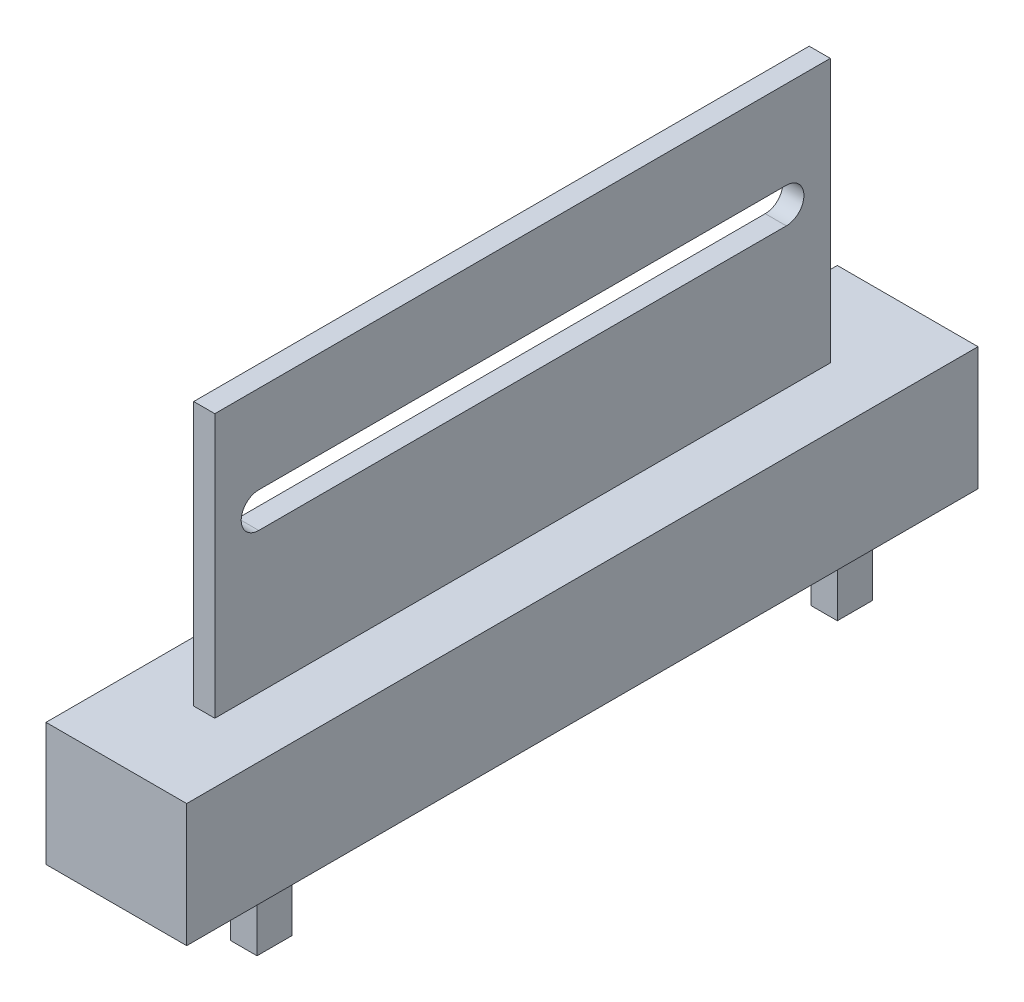
ISO-10303-21;
HEADER;
FILE_DESCRIPTION(('STEP AP214'),'2;1');
FILE_NAME('part.step','',(''),(''),'','','');
FILE_SCHEMA(('AUTOMOTIVE_DESIGN { 1 0 10303 214 1 1 1 1 }'));
ENDSEC;
DATA;
#1=APPLICATION_CONTEXT('core data for automotive mechanical design processes');
#2=APPLICATION_PROTOCOL_DEFINITION('international standard','automotive_design',2000,#1);
#3=PRODUCT_CONTEXT('',#1,'mechanical');
#4=PRODUCT('Part','Part','',(#3));
#5=PRODUCT_RELATED_PRODUCT_CATEGORY('part','',(#4));
#6=PRODUCT_DEFINITION_FORMATION('','',#4);
#7=PRODUCT_DEFINITION_CONTEXT('part definition',#1,'design');
#8=PRODUCT_DEFINITION('design','',#6,#7);
#9=PRODUCT_DEFINITION_SHAPE('','',#8);
#10=(LENGTH_UNIT() NAMED_UNIT(*) SI_UNIT(.MILLI.,.METRE.));
#11=(NAMED_UNIT(*) PLANE_ANGLE_UNIT() SI_UNIT($,.RADIAN.));
#12=(NAMED_UNIT(*) SI_UNIT($,.STERADIAN.) SOLID_ANGLE_UNIT());
#13=UNCERTAINTY_MEASURE_WITH_UNIT(LENGTH_MEASURE(1.E-05),#10,'distance_accuracy_value','');
#14=(GEOMETRIC_REPRESENTATION_CONTEXT(3) GLOBAL_UNCERTAINTY_ASSIGNED_CONTEXT((#13)) GLOBAL_UNIT_ASSIGNED_CONTEXT((#10,
#11,#12)) REPRESENTATION_CONTEXT('',''));
#15=CARTESIAN_POINT('',(0.,0.,0.));
#16=DIRECTION('',(0.,0.,1.));
#17=DIRECTION('',(1.,0.,0.));
#18=AXIS2_PLACEMENT_3D('',#15,#16,#17);
#19=CARTESIAN_POINT('',(-3.,-3.5,-38.));
#20=DIRECTION('',(0.,0.,-1.));
#21=DIRECTION('',(-1.,0.,0.));
#22=AXIS2_PLACEMENT_3D('',#19,#20,#21);
#23=PLANE('',#22);
#24=DIRECTION('',(-1.,0.,0.));
#25=VECTOR('',#24,1.);
#26=CARTESIAN_POINT('',(-3.,0.,-38.));
#27=LINE('',#26,#25);
#28=CARTESIAN_POINT('',(-1.5,0.,-38.));
#29=VERTEX_POINT('',#28);
#30=CARTESIAN_POINT('',(-3.,0.,-38.));
#31=VERTEX_POINT('',#30);
#32=EDGE_CURVE('E12',#29,#31,#27,.T.);
#33=ORIENTED_EDGE('',*,*,#32,.T.);
#34=DIRECTION('',(0.,1.,0.));
#35=VECTOR('',#34,1.);
#36=CARTESIAN_POINT('',(-3.,-3.5,-38.));
#37=LINE('',#36,#35);
#38=CARTESIAN_POINT('',(-3.,-3.5,-38.));
#39=VERTEX_POINT('',#38);
#40=EDGE_CURVE('E121',#39,#31,#37,.T.);
#41=ORIENTED_EDGE('',*,*,#40,.F.);
#42=DIRECTION('',(-1.,0.,0.));
#43=VECTOR('',#42,1.);
#44=CARTESIAN_POINT('',(-3.,-3.5,-38.));
#45=LINE('',#44,#43);
#46=CARTESIAN_POINT('',(-1.5,-3.5,-38.));
#47=VERTEX_POINT('',#46);
#48=EDGE_CURVE('E54',#47,#39,#45,.T.);
#49=ORIENTED_EDGE('',*,*,#48,.F.);
#50=DIRECTION('',(0.,1.,0.));
#51=VECTOR('',#50,1.);
#52=CARTESIAN_POINT('',(-1.5,-3.5,-38.));
#53=LINE('',#52,#51);
#54=EDGE_CURVE('E109',#47,#29,#53,.T.);
#55=ORIENTED_EDGE('',*,*,#54,.T.);
#56=EDGE_LOOP('',(#33,#41,#49,#55));
#57=FACE_BOUND('',#56,.T.);
#58=ADVANCED_FACE('F50',(#57),#23,.F.);
#59=CARTESIAN_POINT('',(-3.,-3.5,-38.));
#60=DIRECTION('',(1.,0.,0.));
#61=DIRECTION('',(0.,0.,-1.));
#62=AXIS2_PLACEMENT_3D('',#59,#60,#61);
#63=PLANE('',#62);
#64=DIRECTION('',(0.,0.,-1.));
#65=VECTOR('',#64,1.);
#66=CARTESIAN_POINT('',(-3.,0.,-38.));
#67=LINE('',#66,#65);
#68=CARTESIAN_POINT('',(-3.,0.,-40.));
#69=VERTEX_POINT('',#68);
#70=EDGE_CURVE('E60',#31,#69,#67,.T.);
#71=ORIENTED_EDGE('',*,*,#70,.T.);
#72=DIRECTION('',(0.,1.,0.));
#73=VECTOR('',#72,1.);
#74=CARTESIAN_POINT('',(-3.,-3.5,-40.));
#75=LINE('',#74,#73);
#76=CARTESIAN_POINT('',(-3.,-3.5,-40.));
#77=VERTEX_POINT('',#76);
#78=EDGE_CURVE('E105',#77,#69,#75,.T.);
#79=ORIENTED_EDGE('',*,*,#78,.F.);
#80=DIRECTION('',(0.,0.,-1.));
#81=VECTOR('',#80,1.);
#82=CARTESIAN_POINT('',(-3.,-3.5,-38.));
#83=LINE('',#82,#81);
#84=EDGE_CURVE('E84',#39,#77,#83,.T.);
#85=ORIENTED_EDGE('',*,*,#84,.F.);
#86=ORIENTED_EDGE('',*,*,#40,.T.);
#87=EDGE_LOOP('',(#71,#79,#85,#86));
#88=FACE_BOUND('',#87,.T.);
#89=ADVANCED_FACE('F124',(#88),#63,.F.);
#90=CARTESIAN_POINT('',(-3.,-3.5,-40.));
#91=DIRECTION('',(0.,0.,1.));
#92=DIRECTION('',(1.,0.,0.));
#93=AXIS2_PLACEMENT_3D('',#90,#91,#92);
#94=PLANE('',#93);
#95=DIRECTION('',(1.,0.,0.));
#96=VECTOR('',#95,1.);
#97=CARTESIAN_POINT('',(-3.,0.,-40.));
#98=LINE('',#97,#96);
#99=CARTESIAN_POINT('',(-1.5,0.,-40.));
#100=VERTEX_POINT('',#99);
#101=EDGE_CURVE('E100',#69,#100,#98,.T.);
#102=ORIENTED_EDGE('',*,*,#101,.T.);
#103=DIRECTION('',(0.,1.,0.));
#104=VECTOR('',#103,1.);
#105=CARTESIAN_POINT('',(-1.5,-3.5,-40.));
#106=LINE('',#105,#104);
#107=CARTESIAN_POINT('',(-1.5,-3.5,-40.));
#108=VERTEX_POINT('',#107);
#109=EDGE_CURVE('E103',#108,#100,#106,.T.);
#110=ORIENTED_EDGE('',*,*,#109,.F.);
#111=DIRECTION('',(1.,0.,0.));
#112=VECTOR('',#111,1.);
#113=CARTESIAN_POINT('',(-3.,-3.5,-40.));
#114=LINE('',#113,#112);
#115=EDGE_CURVE('E117',#77,#108,#114,.T.);
#116=ORIENTED_EDGE('',*,*,#115,.F.);
#117=ORIENTED_EDGE('',*,*,#78,.T.);
#118=EDGE_LOOP('',(#102,#110,#116,#117));
#119=FACE_BOUND('',#118,.T.);
#120=ADVANCED_FACE('F101',(#119),#94,.F.);
#121=CARTESIAN_POINT('',(-1.5,-3.5,-38.));
#122=DIRECTION('',(-1.,0.,0.));
#123=DIRECTION('',(0.,0.,1.));
#124=AXIS2_PLACEMENT_3D('',#121,#122,#123);
#125=PLANE('',#124);
#126=DIRECTION('',(0.,0.,1.));
#127=VECTOR('',#126,1.);
#128=CARTESIAN_POINT('',(-1.5,0.,-38.));
#129=LINE('',#128,#127);
#130=EDGE_CURVE('E94',#100,#29,#129,.T.);
#131=ORIENTED_EDGE('',*,*,#130,.T.);
#132=ORIENTED_EDGE('',*,*,#54,.F.);
#133=DIRECTION('',(0.,0.,1.));
#134=VECTOR('',#133,1.);
#135=CARTESIAN_POINT('',(-1.5,-3.5,-38.));
#136=LINE('',#135,#134);
#137=EDGE_CURVE('E108',#108,#47,#136,.T.);
#138=ORIENTED_EDGE('',*,*,#137,.F.);
#139=ORIENTED_EDGE('',*,*,#109,.T.);
#140=EDGE_LOOP('',(#131,#132,#138,#139));
#141=FACE_BOUND('',#140,.T.);
#142=ADVANCED_FACE('F107',(#141),#125,.F.);
#143=CARTESIAN_POINT('',(0.,-3.5,0.));
#144=DIRECTION('',(0.,1.,0.));
#145=DIRECTION('',(0.,0.,1.));
#146=AXIS2_PLACEMENT_3D('',#143,#144,#145);
#147=PLANE('',#146);
#148=ORIENTED_EDGE('',*,*,#48,.T.);
#149=ORIENTED_EDGE('',*,*,#84,.T.);
#150=ORIENTED_EDGE('',*,*,#115,.T.);
#151=ORIENTED_EDGE('',*,*,#137,.T.);
#152=EDGE_LOOP('',(#148,#149,#150,#151));
#153=FACE_BOUND('',#152,.T.);
#154=ADVANCED_FACE('F52',(#153),#147,.F.);
#155=CARTESIAN_POINT('',(0.,0.,0.));
#156=DIRECTION('',(0.,1.,0.));
#157=DIRECTION('',(0.,0.,1.));
#158=AXIS2_PLACEMENT_3D('',#155,#156,#157);
#159=PLANE('',#158);
#160=ORIENTED_EDGE('',*,*,#32,.F.);
#161=ORIENTED_EDGE('',*,*,#130,.F.);
#162=ORIENTED_EDGE('',*,*,#101,.F.);
#163=ORIENTED_EDGE('',*,*,#70,.F.);
#164=EDGE_LOOP('',(#160,#161,#162,#163));
#165=FACE_BOUND('',#164,.T.);
#166=ADVANCED_FACE('F111',(#165),#159,.T.);
#167=CLOSED_SHELL('',(#58,#89,#120,#142,#154,#166));
#168=MANIFOLD_SOLID_BREP('B2',#167);
#169=CARTESIAN_POINT('',(1.50000000000001,-3.5,-40.));
#170=DIRECTION('',(0.,0.,1.));
#171=DIRECTION('',(1.,0.,0.));
#172=AXIS2_PLACEMENT_3D('',#169,#170,#171);
#173=PLANE('',#172);
#174=DIRECTION('',(1.,0.,0.));
#175=VECTOR('',#174,1.);
#176=CARTESIAN_POINT('',(1.50000000000001,0.,-40.));
#177=LINE('',#176,#175);
#178=CARTESIAN_POINT('',(1.50000000000001,0.,-40.));
#179=VERTEX_POINT('',#178);
#180=CARTESIAN_POINT('',(3.00000000000001,0.,-40.));
#181=VERTEX_POINT('',#180);
#182=EDGE_CURVE('E48',#179,#181,#177,.T.);
#183=ORIENTED_EDGE('',*,*,#182,.T.);
#184=DIRECTION('',(0.,1.,0.));
#185=VECTOR('',#184,1.);
#186=CARTESIAN_POINT('',(3.00000000000001,-3.5,-40.));
#187=LINE('',#186,#185);
#188=CARTESIAN_POINT('',(3.00000000000001,-3.5,-40.));
#189=VERTEX_POINT('',#188);
#190=EDGE_CURVE('E267',#189,#181,#187,.T.);
#191=ORIENTED_EDGE('',*,*,#190,.F.);
#192=DIRECTION('',(1.,0.,0.));
#193=VECTOR('',#192,1.);
#194=CARTESIAN_POINT('',(1.50000000000001,-3.5,-40.));
#195=LINE('',#194,#193);
#196=CARTESIAN_POINT('',(1.50000000000001,-3.5,-40.));
#197=VERTEX_POINT('',#196);
#198=EDGE_CURVE('E200',#197,#189,#195,.T.);
#199=ORIENTED_EDGE('',*,*,#198,.F.);
#200=DIRECTION('',(0.,1.,0.));
#201=VECTOR('',#200,1.);
#202=CARTESIAN_POINT('',(1.50000000000001,-3.5,-40.));
#203=LINE('',#202,#201);
#204=EDGE_CURVE('E255',#197,#179,#203,.T.);
#205=ORIENTED_EDGE('',*,*,#204,.T.);
#206=EDGE_LOOP('',(#183,#191,#199,#205));
#207=FACE_BOUND('',#206,.T.);
#208=ADVANCED_FACE('F196',(#207),#173,.F.);
#209=CARTESIAN_POINT('',(3.00000000000001,-3.5,-40.));
#210=DIRECTION('',(-1.,0.,0.));
#211=DIRECTION('',(0.,0.,1.));
#212=AXIS2_PLACEMENT_3D('',#209,#210,#211);
#213=PLANE('',#212);
#214=DIRECTION('',(0.,0.,1.));
#215=VECTOR('',#214,1.);
#216=CARTESIAN_POINT('',(3.00000000000001,0.,-40.));
#217=LINE('',#216,#215);
#218=CARTESIAN_POINT('',(3.00000000000001,0.,-38.));
#219=VERTEX_POINT('',#218);
#220=EDGE_CURVE('E206',#181,#219,#217,.T.);
#221=ORIENTED_EDGE('',*,*,#220,.T.);
#222=DIRECTION('',(0.,1.,0.));
#223=VECTOR('',#222,1.);
#224=CARTESIAN_POINT('',(3.00000000000001,-3.5,-38.));
#225=LINE('',#224,#223);
#226=CARTESIAN_POINT('',(3.00000000000001,-3.5,-38.));
#227=VERTEX_POINT('',#226);
#228=EDGE_CURVE('E251',#227,#219,#225,.T.);
#229=ORIENTED_EDGE('',*,*,#228,.F.);
#230=DIRECTION('',(0.,0.,1.));
#231=VECTOR('',#230,1.);
#232=CARTESIAN_POINT('',(3.00000000000001,-3.5,-40.));
#233=LINE('',#232,#231);
#234=EDGE_CURVE('E230',#189,#227,#233,.T.);
#235=ORIENTED_EDGE('',*,*,#234,.F.);
#236=ORIENTED_EDGE('',*,*,#190,.T.);
#237=EDGE_LOOP('',(#221,#229,#235,#236));
#238=FACE_BOUND('',#237,.T.);
#239=ADVANCED_FACE('F270',(#238),#213,.F.);
#240=CARTESIAN_POINT('',(1.50000000000001,-3.5,-38.));
#241=DIRECTION('',(0.,0.,-1.));
#242=DIRECTION('',(-1.,0.,0.));
#243=AXIS2_PLACEMENT_3D('',#240,#241,#242);
#244=PLANE('',#243);
#245=DIRECTION('',(-1.,0.,0.));
#246=VECTOR('',#245,1.);
#247=CARTESIAN_POINT('',(1.50000000000001,0.,-38.));
#248=LINE('',#247,#246);
#249=CARTESIAN_POINT('',(1.50000000000001,0.,-38.));
#250=VERTEX_POINT('',#249);
#251=EDGE_CURVE('E246',#219,#250,#248,.T.);
#252=ORIENTED_EDGE('',*,*,#251,.T.);
#253=DIRECTION('',(0.,1.,0.));
#254=VECTOR('',#253,1.);
#255=CARTESIAN_POINT('',(1.50000000000001,-3.5,-38.));
#256=LINE('',#255,#254);
#257=CARTESIAN_POINT('',(1.50000000000001,-3.5,-38.));
#258=VERTEX_POINT('',#257);
#259=EDGE_CURVE('E249',#258,#250,#256,.T.);
#260=ORIENTED_EDGE('',*,*,#259,.F.);
#261=DIRECTION('',(-1.,0.,0.));
#262=VECTOR('',#261,1.);
#263=CARTESIAN_POINT('',(1.50000000000001,-3.5,-38.));
#264=LINE('',#263,#262);
#265=EDGE_CURVE('E263',#227,#258,#264,.T.);
#266=ORIENTED_EDGE('',*,*,#265,.F.);
#267=ORIENTED_EDGE('',*,*,#228,.T.);
#268=EDGE_LOOP('',(#252,#260,#266,#267));
#269=FACE_BOUND('',#268,.T.);
#270=ADVANCED_FACE('F247',(#269),#244,.F.);
#271=CARTESIAN_POINT('',(1.50000000000001,-3.5,-40.));
#272=DIRECTION('',(1.,0.,0.));
#273=DIRECTION('',(0.,0.,-1.));
#274=AXIS2_PLACEMENT_3D('',#271,#272,#273);
#275=PLANE('',#274);
#276=DIRECTION('',(0.,0.,-1.));
#277=VECTOR('',#276,1.);
#278=CARTESIAN_POINT('',(1.50000000000001,0.,-40.));
#279=LINE('',#278,#277);
#280=EDGE_CURVE('E240',#250,#179,#279,.T.);
#281=ORIENTED_EDGE('',*,*,#280,.T.);
#282=ORIENTED_EDGE('',*,*,#204,.F.);
#283=DIRECTION('',(0.,0.,-1.));
#284=VECTOR('',#283,1.);
#285=CARTESIAN_POINT('',(1.50000000000001,-3.5,-40.));
#286=LINE('',#285,#284);
#287=EDGE_CURVE('E254',#258,#197,#286,.T.);
#288=ORIENTED_EDGE('',*,*,#287,.F.);
#289=ORIENTED_EDGE('',*,*,#259,.T.);
#290=EDGE_LOOP('',(#281,#282,#288,#289));
#291=FACE_BOUND('',#290,.T.);
#292=ADVANCED_FACE('F253',(#291),#275,.F.);
#293=CARTESIAN_POINT('',(0.,-3.5,0.));
#294=DIRECTION('',(0.,-1.,0.));
#295=DIRECTION('',(0.,0.,-1.));
#296=AXIS2_PLACEMENT_3D('',#293,#294,#295);
#297=PLANE('',#296);
#298=ORIENTED_EDGE('',*,*,#198,.T.);
#299=ORIENTED_EDGE('',*,*,#234,.T.);
#300=ORIENTED_EDGE('',*,*,#265,.T.);
#301=ORIENTED_EDGE('',*,*,#287,.T.);
#302=EDGE_LOOP('',(#298,#299,#300,#301));
#303=FACE_BOUND('',#302,.T.);
#304=ADVANCED_FACE('F198',(#303),#297,.T.);
#305=CARTESIAN_POINT('',(0.,0.,0.));
#306=DIRECTION('',(0.,-1.,0.));
#307=DIRECTION('',(0.,0.,-1.));
#308=AXIS2_PLACEMENT_3D('',#305,#306,#307);
#309=PLANE('',#308);
#310=ORIENTED_EDGE('',*,*,#182,.F.);
#311=ORIENTED_EDGE('',*,*,#280,.F.);
#312=ORIENTED_EDGE('',*,*,#251,.F.);
#313=ORIENTED_EDGE('',*,*,#220,.F.);
#314=EDGE_LOOP('',(#310,#311,#312,#313));
#315=FACE_BOUND('',#314,.T.);
#316=ADVANCED_FACE('F257',(#315),#309,.F.);
#317=CLOSED_SHELL('',(#208,#239,#270,#292,#304,#316));
#318=MANIFOLD_SOLID_BREP('B6',#317);
#319=CARTESIAN_POINT('',(1.50000000000001,-3.5,-5.));
#320=DIRECTION('',(1.,0.,0.));
#321=DIRECTION('',(0.,0.,-1.));
#322=AXIS2_PLACEMENT_3D('',#319,#320,#321);
#323=PLANE('',#322);
#324=DIRECTION('',(0.,0.,-1.));
#325=VECTOR('',#324,1.);
#326=CARTESIAN_POINT('',(1.50000000000001,0.,-5.));
#327=LINE('',#326,#325);
#328=CARTESIAN_POINT('',(1.50000000000001,0.,-5.));
#329=VERTEX_POINT('',#328);
#330=CARTESIAN_POINT('',(1.50000000000001,0.,-7.));
#331=VERTEX_POINT('',#330);
#332=EDGE_CURVE('E194',#329,#331,#327,.T.);
#333=ORIENTED_EDGE('',*,*,#332,.T.);
#334=DIRECTION('',(0.,1.,0.));
#335=VECTOR('',#334,1.);
#336=CARTESIAN_POINT('',(1.50000000000001,-3.5,-7.));
#337=LINE('',#336,#335);
#338=CARTESIAN_POINT('',(1.50000000000001,-3.5,-7.));
#339=VERTEX_POINT('',#338);
#340=EDGE_CURVE('E413',#339,#331,#337,.T.);
#341=ORIENTED_EDGE('',*,*,#340,.F.);
#342=DIRECTION('',(0.,0.,-1.));
#343=VECTOR('',#342,1.);
#344=CARTESIAN_POINT('',(1.50000000000001,-3.5,-5.));
#345=LINE('',#344,#343);
#346=CARTESIAN_POINT('',(1.50000000000001,-3.5,-5.));
#347=VERTEX_POINT('',#346);
#348=EDGE_CURVE('E346',#347,#339,#345,.T.);
#349=ORIENTED_EDGE('',*,*,#348,.F.);
#350=DIRECTION('',(0.,1.,0.));
#351=VECTOR('',#350,1.);
#352=CARTESIAN_POINT('',(1.50000000000001,-3.5,-5.));
#353=LINE('',#352,#351);
#354=EDGE_CURVE('E401',#347,#329,#353,.T.);
#355=ORIENTED_EDGE('',*,*,#354,.T.);
#356=EDGE_LOOP('',(#333,#341,#349,#355));
#357=FACE_BOUND('',#356,.T.);
#358=ADVANCED_FACE('F342',(#357),#323,.F.);
#359=CARTESIAN_POINT('',(1.50000000000001,-3.5,-7.));
#360=DIRECTION('',(0.,0.,1.));
#361=DIRECTION('',(1.,0.,0.));
#362=AXIS2_PLACEMENT_3D('',#359,#360,#361);
#363=PLANE('',#362);
#364=DIRECTION('',(1.,0.,0.));
#365=VECTOR('',#364,1.);
#366=CARTESIAN_POINT('',(1.50000000000001,0.,-7.));
#367=LINE('',#366,#365);
#368=CARTESIAN_POINT('',(3.00000000000001,0.,-7.));
#369=VERTEX_POINT('',#368);
#370=EDGE_CURVE('E352',#331,#369,#367,.T.);
#371=ORIENTED_EDGE('',*,*,#370,.T.);
#372=DIRECTION('',(0.,1.,0.));
#373=VECTOR('',#372,1.);
#374=CARTESIAN_POINT('',(3.00000000000001,-3.5,-7.));
#375=LINE('',#374,#373);
#376=CARTESIAN_POINT('',(3.00000000000001,-3.5,-7.));
#377=VERTEX_POINT('',#376);
#378=EDGE_CURVE('E397',#377,#369,#375,.T.);
#379=ORIENTED_EDGE('',*,*,#378,.F.);
#380=DIRECTION('',(1.,0.,0.));
#381=VECTOR('',#380,1.);
#382=CARTESIAN_POINT('',(1.50000000000001,-3.5,-7.));
#383=LINE('',#382,#381);
#384=EDGE_CURVE('E376',#339,#377,#383,.T.);
#385=ORIENTED_EDGE('',*,*,#384,.F.);
#386=ORIENTED_EDGE('',*,*,#340,.T.);
#387=EDGE_LOOP('',(#371,#379,#385,#386));
#388=FACE_BOUND('',#387,.T.);
#389=ADVANCED_FACE('F416',(#388),#363,.F.);
#390=CARTESIAN_POINT('',(3.00000000000001,-3.5,-5.));
#391=DIRECTION('',(-1.,0.,0.));
#392=DIRECTION('',(0.,0.,1.));
#393=AXIS2_PLACEMENT_3D('',#390,#391,#392);
#394=PLANE('',#393);
#395=DIRECTION('',(0.,0.,1.));
#396=VECTOR('',#395,1.);
#397=CARTESIAN_POINT('',(3.00000000000001,0.,-5.));
#398=LINE('',#397,#396);
#399=CARTESIAN_POINT('',(3.00000000000001,0.,-5.));
#400=VERTEX_POINT('',#399);
#401=EDGE_CURVE('E392',#369,#400,#398,.T.);
#402=ORIENTED_EDGE('',*,*,#401,.T.);
#403=DIRECTION('',(0.,1.,0.));
#404=VECTOR('',#403,1.);
#405=CARTESIAN_POINT('',(3.00000000000001,-3.5,-5.));
#406=LINE('',#405,#404);
#407=CARTESIAN_POINT('',(3.00000000000001,-3.5,-5.));
#408=VERTEX_POINT('',#407);
#409=EDGE_CURVE('E395',#408,#400,#406,.T.);
#410=ORIENTED_EDGE('',*,*,#409,.F.);
#411=DIRECTION('',(0.,0.,1.));
#412=VECTOR('',#411,1.);
#413=CARTESIAN_POINT('',(3.00000000000001,-3.5,-5.));
#414=LINE('',#413,#412);
#415=EDGE_CURVE('E409',#377,#408,#414,.T.);
#416=ORIENTED_EDGE('',*,*,#415,.F.);
#417=ORIENTED_EDGE('',*,*,#378,.T.);
#418=EDGE_LOOP('',(#402,#410,#416,#417));
#419=FACE_BOUND('',#418,.T.);
#420=ADVANCED_FACE('F393',(#419),#394,.F.);
#421=CARTESIAN_POINT('',(1.50000000000001,-3.5,-5.));
#422=DIRECTION('',(0.,0.,-1.));
#423=DIRECTION('',(-1.,0.,0.));
#424=AXIS2_PLACEMENT_3D('',#421,#422,#423);
#425=PLANE('',#424);
#426=DIRECTION('',(-1.,0.,0.));
#427=VECTOR('',#426,1.);
#428=CARTESIAN_POINT('',(1.50000000000001,0.,-5.));
#429=LINE('',#428,#427);
#430=EDGE_CURVE('E386',#400,#329,#429,.T.);
#431=ORIENTED_EDGE('',*,*,#430,.T.);
#432=ORIENTED_EDGE('',*,*,#354,.F.);
#433=DIRECTION('',(-1.,0.,0.));
#434=VECTOR('',#433,1.);
#435=CARTESIAN_POINT('',(1.50000000000001,-3.5,-5.));
#436=LINE('',#435,#434);
#437=EDGE_CURVE('E400',#408,#347,#436,.T.);
#438=ORIENTED_EDGE('',*,*,#437,.F.);
#439=ORIENTED_EDGE('',*,*,#409,.T.);
#440=EDGE_LOOP('',(#431,#432,#438,#439));
#441=FACE_BOUND('',#440,.T.);
#442=ADVANCED_FACE('F399',(#441),#425,.F.);
#443=CARTESIAN_POINT('',(0.,-3.5,0.));
#444=DIRECTION('',(0.,-1.,0.));
#445=DIRECTION('',(0.,0.,-1.));
#446=AXIS2_PLACEMENT_3D('',#443,#444,#445);
#447=PLANE('',#446);
#448=ORIENTED_EDGE('',*,*,#348,.T.);
#449=ORIENTED_EDGE('',*,*,#384,.T.);
#450=ORIENTED_EDGE('',*,*,#415,.T.);
#451=ORIENTED_EDGE('',*,*,#437,.T.);
#452=EDGE_LOOP('',(#448,#449,#450,#451));
#453=FACE_BOUND('',#452,.T.);
#454=ADVANCED_FACE('F344',(#453),#447,.T.);
#455=CARTESIAN_POINT('',(0.,0.,0.));
#456=DIRECTION('',(0.,-1.,0.));
#457=DIRECTION('',(0.,0.,-1.));
#458=AXIS2_PLACEMENT_3D('',#455,#456,#457);
#459=PLANE('',#458);
#460=ORIENTED_EDGE('',*,*,#332,.F.);
#461=ORIENTED_EDGE('',*,*,#430,.F.);
#462=ORIENTED_EDGE('',*,*,#401,.F.);
#463=ORIENTED_EDGE('',*,*,#370,.F.);
#464=EDGE_LOOP('',(#460,#461,#462,#463));
#465=FACE_BOUND('',#464,.T.);
#466=ADVANCED_FACE('F403',(#465),#459,.F.);
#467=CLOSED_SHELL('',(#358,#389,#420,#442,#454,#466));
#468=MANIFOLD_SOLID_BREP('B42',#467);
#469=CARTESIAN_POINT('',(-3.,-3.5,-7.));
#470=DIRECTION('',(1.,0.,0.));
#471=DIRECTION('',(0.,0.,-1.));
#472=AXIS2_PLACEMENT_3D('',#469,#470,#471);
#473=PLANE('',#472);
#474=DIRECTION('',(0.,0.,-1.));
#475=VECTOR('',#474,1.);
#476=CARTESIAN_POINT('',(-3.,0.,-7.));
#477=LINE('',#476,#475);
#478=CARTESIAN_POINT('',(-3.,0.,-5.));
#479=VERTEX_POINT('',#478);
#480=CARTESIAN_POINT('',(-3.,0.,-7.));
#481=VERTEX_POINT('',#480);
#482=EDGE_CURVE('E551',#479,#481,#477,.T.);
#483=ORIENTED_EDGE('',*,*,#482,.T.);
#484=DIRECTION('',(0.,1.,0.));
#485=VECTOR('',#484,1.);
#486=CARTESIAN_POINT('',(-3.,-3.5,-7.));
#487=LINE('',#486,#485);
#488=CARTESIAN_POINT('',(-3.,-3.5,-7.));
#489=VERTEX_POINT('',#488);
#490=EDGE_CURVE('E340',#489,#481,#487,.T.);
#491=ORIENTED_EDGE('',*,*,#490,.F.);
#492=DIRECTION('',(0.,0.,-1.));
#493=VECTOR('',#492,1.);
#494=CARTESIAN_POINT('',(-3.,-3.5,-7.));
#495=LINE('',#494,#493);
#496=CARTESIAN_POINT('',(-3.,-3.5,-5.));
#497=VERTEX_POINT('',#496);
#498=EDGE_CURVE('E539',#497,#489,#495,.T.);
#499=ORIENTED_EDGE('',*,*,#498,.F.);
#500=DIRECTION('',(0.,1.,0.));
#501=VECTOR('',#500,1.);
#502=CARTESIAN_POINT('',(-3.,-3.5,-5.));
#503=LINE('',#502,#501);
#504=EDGE_CURVE('E547',#497,#479,#503,.T.);
#505=ORIENTED_EDGE('',*,*,#504,.T.);
#506=EDGE_LOOP('',(#483,#491,#499,#505));
#507=FACE_BOUND('',#506,.T.);
#508=ADVANCED_FACE('F488',(#507),#473,.F.);
#509=CARTESIAN_POINT('',(-3.,-3.5,-7.));
#510=DIRECTION('',(0.,0.,1.));
#511=DIRECTION('',(1.,0.,0.));
#512=AXIS2_PLACEMENT_3D('',#509,#510,#511);
#513=PLANE('',#512);
#514=DIRECTION('',(1.,0.,0.));
#515=VECTOR('',#514,1.);
#516=CARTESIAN_POINT('',(-3.,0.,-7.));
#517=LINE('',#516,#515);
#518=CARTESIAN_POINT('',(-1.5,0.,-7.));
#519=VERTEX_POINT('',#518);
#520=EDGE_CURVE('E543',#481,#519,#517,.T.);
#521=ORIENTED_EDGE('',*,*,#520,.T.);
#522=DIRECTION('',(0.,1.,0.));
#523=VECTOR('',#522,1.);
#524=CARTESIAN_POINT('',(-1.5,-3.5,-7.));
#525=LINE('',#524,#523);
#526=CARTESIAN_POINT('',(-1.5,-3.5,-7.));
#527=VERTEX_POINT('',#526);
#528=EDGE_CURVE('E496',#527,#519,#525,.T.);
#529=ORIENTED_EDGE('',*,*,#528,.F.);
#530=DIRECTION('',(1.,0.,0.));
#531=VECTOR('',#530,1.);
#532=CARTESIAN_POINT('',(-3.,-3.5,-7.));
#533=LINE('',#532,#531);
#534=EDGE_CURVE('E534',#489,#527,#533,.T.);
#535=ORIENTED_EDGE('',*,*,#534,.F.);
#536=ORIENTED_EDGE('',*,*,#490,.T.);
#537=EDGE_LOOP('',(#521,#529,#535,#536));
#538=FACE_BOUND('',#537,.T.);
#539=ADVANCED_FACE('F542',(#538),#513,.F.);
#540=CARTESIAN_POINT('',(-1.5,-3.5,-7.));
#541=DIRECTION('',(-1.,0.,0.));
#542=DIRECTION('',(0.,0.,1.));
#543=AXIS2_PLACEMENT_3D('',#540,#541,#542);
#544=PLANE('',#543);
#545=DIRECTION('',(0.,0.,1.));
#546=VECTOR('',#545,1.);
#547=CARTESIAN_POINT('',(-1.5,0.,-7.));
#548=LINE('',#547,#546);
#549=CARTESIAN_POINT('',(-1.5,0.,-5.));
#550=VERTEX_POINT('',#549);
#551=EDGE_CURVE('E521',#519,#550,#548,.T.);
#552=ORIENTED_EDGE('',*,*,#551,.T.);
#553=DIRECTION('',(0.,1.,0.));
#554=VECTOR('',#553,1.);
#555=CARTESIAN_POINT('',(-1.5,-3.5,-5.));
#556=LINE('',#555,#554);
#557=CARTESIAN_POINT('',(-1.5,-3.5,-5.));
#558=VERTEX_POINT('',#557);
#559=EDGE_CURVE('E544',#558,#550,#556,.T.);
#560=ORIENTED_EDGE('',*,*,#559,.F.);
#561=DIRECTION('',(0.,0.,1.));
#562=VECTOR('',#561,1.);
#563=CARTESIAN_POINT('',(-1.5,-3.5,-7.));
#564=LINE('',#563,#562);
#565=EDGE_CURVE('E537',#527,#558,#564,.T.);
#566=ORIENTED_EDGE('',*,*,#565,.F.);
#567=ORIENTED_EDGE('',*,*,#528,.T.);
#568=EDGE_LOOP('',(#552,#560,#566,#567));
#569=FACE_BOUND('',#568,.T.);
#570=ADVANCED_FACE('F545',(#569),#544,.F.);
#571=CARTESIAN_POINT('',(-3.,-3.5,-5.));
#572=DIRECTION('',(0.,0.,-1.));
#573=DIRECTION('',(-1.,0.,0.));
#574=AXIS2_PLACEMENT_3D('',#571,#572,#573);
#575=PLANE('',#574);
#576=DIRECTION('',(-1.,0.,0.));
#577=VECTOR('',#576,1.);
#578=CARTESIAN_POINT('',(-3.,0.,-5.));
#579=LINE('',#578,#577);
#580=EDGE_CURVE('E527',#550,#479,#579,.T.);
#581=ORIENTED_EDGE('',*,*,#580,.T.);
#582=ORIENTED_EDGE('',*,*,#504,.F.);
#583=DIRECTION('',(-1.,0.,0.));
#584=VECTOR('',#583,1.);
#585=CARTESIAN_POINT('',(-3.,-3.5,-5.));
#586=LINE('',#585,#584);
#587=EDGE_CURVE('E504',#558,#497,#586,.T.);
#588=ORIENTED_EDGE('',*,*,#587,.F.);
#589=ORIENTED_EDGE('',*,*,#559,.T.);
#590=EDGE_LOOP('',(#581,#582,#588,#589));
#591=FACE_BOUND('',#590,.T.);
#592=ADVANCED_FACE('F558',(#591),#575,.F.);
#593=CARTESIAN_POINT('',(0.,-3.5,0.));
#594=DIRECTION('',(0.,1.,0.));
#595=DIRECTION('',(0.,0.,1.));
#596=AXIS2_PLACEMENT_3D('',#593,#594,#595);
#597=PLANE('',#596);
#598=ORIENTED_EDGE('',*,*,#498,.T.);
#599=ORIENTED_EDGE('',*,*,#534,.T.);
#600=ORIENTED_EDGE('',*,*,#565,.T.);
#601=ORIENTED_EDGE('',*,*,#587,.T.);
#602=EDGE_LOOP('',(#598,#599,#600,#601));
#603=FACE_BOUND('',#602,.T.);
#604=ADVANCED_FACE('F535',(#603),#597,.F.);
#605=CARTESIAN_POINT('',(0.,0.,0.));
#606=DIRECTION('',(0.,1.,0.));
#607=DIRECTION('',(0.,0.,1.));
#608=AXIS2_PLACEMENT_3D('',#605,#606,#607);
#609=PLANE('',#608);
#610=ORIENTED_EDGE('',*,*,#482,.F.);
#611=ORIENTED_EDGE('',*,*,#580,.F.);
#612=ORIENTED_EDGE('',*,*,#551,.F.);
#613=ORIENTED_EDGE('',*,*,#520,.F.);
#614=EDGE_LOOP('',(#610,#611,#612,#613));
#615=FACE_BOUND('',#614,.T.);
#616=ADVANCED_FACE('F561',(#615),#609,.T.);
#617=CLOSED_SHELL('',(#508,#539,#570,#592,#604,#616));
#618=MANIFOLD_SOLID_BREP('B188',#617);
#619=CARTESIAN_POINT('',(-0.6,22.,-40.));
#620=DIRECTION('',(1.,0.,0.));
#621=DIRECTION('',(0.,0.,-1.));
#622=AXIS2_PLACEMENT_3D('',#619,#620,#621);
#623=PLANE('',#622);
#624=DIRECTION('',(0.,0.,1.));
#625=VECTOR('',#624,1.);
#626=CARTESIAN_POINT('',(-0.6,17.,-40.));
#627=LINE('',#626,#625);
#628=CARTESIAN_POINT('',(-0.6,17.,-37.5));
#629=VERTEX_POINT('',#628);
#630=CARTESIAN_POINT('',(-0.6,17.,-7.5));
#631=VERTEX_POINT('',#630);
#632=EDGE_CURVE('E728',#629,#631,#627,.T.);
#633=ORIENTED_EDGE('',*,*,#632,.T.);
#634=CARTESIAN_POINT('',(-0.6,16.,-7.5));
#635=DIRECTION('',(1.,0.,0.));
#636=DIRECTION('',(0.,0.,-1.));
#637=AXIS2_PLACEMENT_3D('',#634,#635,#636);
#638=CIRCLE('',#637,0.999999999999997);
#639=CARTESIAN_POINT('',(-0.6,15.,-7.5));
#640=VERTEX_POINT('',#639);
#641=EDGE_CURVE('E731',#631,#640,#638,.T.);
#642=ORIENTED_EDGE('',*,*,#641,.T.);
#643=DIRECTION('',(0.,0.,-1.));
#644=VECTOR('',#643,1.);
#645=CARTESIAN_POINT('',(-0.6,15.,-40.));
#646=LINE('',#645,#644);
#647=CARTESIAN_POINT('',(-0.6,15.,-37.5));
#648=VERTEX_POINT('',#647);
#649=EDGE_CURVE('E723',#640,#648,#646,.T.);
#650=ORIENTED_EDGE('',*,*,#649,.T.);
#651=CARTESIAN_POINT('',(-0.6,16.,-37.5));
#652=DIRECTION('',(1.,0.,0.));
#653=DIRECTION('',(0.,0.,-1.));
#654=AXIS2_PLACEMENT_3D('',#651,#652,#653);
#655=CIRCLE('',#654,0.999999999999997);
#656=EDGE_CURVE('E703',#648,#629,#655,.T.);
#657=ORIENTED_EDGE('',*,*,#656,.T.);
#658=EDGE_LOOP('',(#633,#642,#650,#657));
#659=FACE_BOUND('',#658,.T.);
#660=DIRECTION('',(0.,0.,1.));
#661=VECTOR('',#660,1.);
#662=CARTESIAN_POINT('',(-0.6,7.,-40.));
#663=LINE('',#662,#661);
#664=CARTESIAN_POINT('',(-0.6,7.,-40.));
#665=VERTEX_POINT('',#664);
#666=CARTESIAN_POINT('',(-0.6,7.,-5.));
#667=VERTEX_POINT('',#666);
#668=EDGE_CURVE('E734',#665,#667,#663,.T.);
#669=ORIENTED_EDGE('',*,*,#668,.T.);
#670=DIRECTION('',(0.,-1.,0.));
#671=VECTOR('',#670,1.);
#672=CARTESIAN_POINT('',(-0.6,22.,-5.));
#673=LINE('',#672,#671);
#674=CARTESIAN_POINT('',(-0.6,22.,-5.));
#675=VERTEX_POINT('',#674);
#676=EDGE_CURVE('E486',#675,#667,#673,.T.);
#677=ORIENTED_EDGE('',*,*,#676,.F.);
#678=DIRECTION('',(0.,0.,1.));
#679=VECTOR('',#678,1.);
#680=CARTESIAN_POINT('',(-0.6,22.,-40.));
#681=LINE('',#680,#679);
#682=CARTESIAN_POINT('',(-0.6,22.,-40.));
#683=VERTEX_POINT('',#682);
#684=EDGE_CURVE('E735',#683,#675,#681,.T.);
#685=ORIENTED_EDGE('',*,*,#684,.F.);
#686=DIRECTION('',(0.,-1.,0.));
#687=VECTOR('',#686,1.);
#688=CARTESIAN_POINT('',(-0.6,22.,-40.));
#689=LINE('',#688,#687);
#690=EDGE_CURVE('E745',#683,#665,#689,.T.);
#691=ORIENTED_EDGE('',*,*,#690,.T.);
#692=EDGE_LOOP('',(#669,#677,#685,#691));
#693=FACE_BOUND('',#692,.T.);
#694=ADVANCED_FACE('F633',(#659,#693),#623,.F.);
#695=CARTESIAN_POINT('',(-0.6,22.,-5.));
#696=DIRECTION('',(0.,0.,-1.));
#697=DIRECTION('',(-1.,0.,0.));
#698=AXIS2_PLACEMENT_3D('',#695,#696,#697);
#699=PLANE('',#698);
#700=DIRECTION('',(1.,0.,0.));
#701=VECTOR('',#700,1.);
#702=CARTESIAN_POINT('',(-0.6,7.,-5.));
#703=LINE('',#702,#701);
#704=CARTESIAN_POINT('',(0.6,7.,-5.));
#705=VERTEX_POINT('',#704);
#706=EDGE_CURVE('E748',#667,#705,#703,.T.);
#707=ORIENTED_EDGE('',*,*,#706,.T.);
#708=DIRECTION('',(0.,-1.,0.));
#709=VECTOR('',#708,1.);
#710=CARTESIAN_POINT('',(0.6,22.,-5.));
#711=LINE('',#710,#709);
#712=CARTESIAN_POINT('',(0.6,22.,-5.));
#713=VERTEX_POINT('',#712);
#714=EDGE_CURVE('E640',#713,#705,#711,.T.);
#715=ORIENTED_EDGE('',*,*,#714,.F.);
#716=DIRECTION('',(1.,0.,0.));
#717=VECTOR('',#716,1.);
#718=CARTESIAN_POINT('',(-0.6,22.,-5.));
#719=LINE('',#718,#717);
#720=EDGE_CURVE('E738',#675,#713,#719,.T.);
#721=ORIENTED_EDGE('',*,*,#720,.F.);
#722=ORIENTED_EDGE('',*,*,#676,.T.);
#723=EDGE_LOOP('',(#707,#715,#721,#722));
#724=FACE_BOUND('',#723,.T.);
#725=ADVANCED_FACE('F776',(#724),#699,.F.);
#726=CARTESIAN_POINT('',(0.6,22.,-40.));
#727=DIRECTION('',(-1.,0.,0.));
#728=DIRECTION('',(0.,0.,1.));
#729=AXIS2_PLACEMENT_3D('',#726,#727,#728);
#730=PLANE('',#729);
#731=DIRECTION('',(0.,0.,-1.));
#732=VECTOR('',#731,1.);
#733=CARTESIAN_POINT('',(0.6,15.,-7.5));
#734=LINE('',#733,#732);
#735=CARTESIAN_POINT('',(0.6,15.,-7.5));
#736=VERTEX_POINT('',#735);
#737=CARTESIAN_POINT('',(0.6,15.,-37.5));
#738=VERTEX_POINT('',#737);
#739=EDGE_CURVE('E709',#736,#738,#734,.T.);
#740=ORIENTED_EDGE('',*,*,#739,.F.);
#741=CARTESIAN_POINT('',(0.6,16.,-7.5));
#742=DIRECTION('',(1.,0.,0.));
#743=DIRECTION('',(0.,0.,-1.));
#744=AXIS2_PLACEMENT_3D('',#741,#742,#743);
#745=CIRCLE('',#744,0.999999999999997);
#746=CARTESIAN_POINT('',(0.6,17.,-7.5));
#747=VERTEX_POINT('',#746);
#748=EDGE_CURVE('E655',#747,#736,#745,.T.);
#749=ORIENTED_EDGE('',*,*,#748,.F.);
#750=DIRECTION('',(0.,0.,1.));
#751=VECTOR('',#750,1.);
#752=CARTESIAN_POINT('',(0.6,17.,-7.5));
#753=LINE('',#752,#751);
#754=CARTESIAN_POINT('',(0.6,17.,-37.5));
#755=VERTEX_POINT('',#754);
#756=EDGE_CURVE('E716',#755,#747,#753,.T.);
#757=ORIENTED_EDGE('',*,*,#756,.F.);
#758=CARTESIAN_POINT('',(0.6,16.,-37.5));
#759=DIRECTION('',(1.,0.,0.));
#760=DIRECTION('',(0.,0.,-1.));
#761=AXIS2_PLACEMENT_3D('',#758,#759,#760);
#762=CIRCLE('',#761,0.999999999999997);
#763=EDGE_CURVE('E700',#738,#755,#762,.T.);
#764=ORIENTED_EDGE('',*,*,#763,.F.);
#765=EDGE_LOOP('',(#740,#749,#757,#764));
#766=FACE_BOUND('',#765,.T.);
#767=DIRECTION('',(0.,0.,-1.));
#768=VECTOR('',#767,1.);
#769=CARTESIAN_POINT('',(0.6,7.,-40.));
#770=LINE('',#769,#768);
#771=CARTESIAN_POINT('',(0.6,7.,-40.));
#772=VERTEX_POINT('',#771);
#773=EDGE_CURVE('E750',#705,#772,#770,.T.);
#774=ORIENTED_EDGE('',*,*,#773,.T.);
#775=DIRECTION('',(0.,-1.,0.));
#776=VECTOR('',#775,1.);
#777=CARTESIAN_POINT('',(0.6,22.,-40.));
#778=LINE('',#777,#776);
#779=CARTESIAN_POINT('',(0.6,22.,-40.));
#780=VERTEX_POINT('',#779);
#781=EDGE_CURVE('E755',#780,#772,#778,.T.);
#782=ORIENTED_EDGE('',*,*,#781,.F.);
#783=DIRECTION('',(0.,0.,-1.));
#784=VECTOR('',#783,1.);
#785=CARTESIAN_POINT('',(0.6,22.,-40.));
#786=LINE('',#785,#784);
#787=EDGE_CURVE('E741',#713,#780,#786,.T.);
#788=ORIENTED_EDGE('',*,*,#787,.F.);
#789=ORIENTED_EDGE('',*,*,#714,.T.);
#790=EDGE_LOOP('',(#774,#782,#788,#789));
#791=FACE_BOUND('',#790,.T.);
#792=ADVANCED_FACE('F713',(#766,#791),#730,.F.);
#793=CARTESIAN_POINT('',(-0.6,22.,-40.));
#794=DIRECTION('',(0.,0.,1.));
#795=DIRECTION('',(1.,0.,0.));
#796=AXIS2_PLACEMENT_3D('',#793,#794,#795);
#797=PLANE('',#796);
#798=DIRECTION('',(-1.,0.,0.));
#799=VECTOR('',#798,1.);
#800=CARTESIAN_POINT('',(-0.6,7.,-40.));
#801=LINE('',#800,#799);
#802=EDGE_CURVE('E739',#772,#665,#801,.T.);
#803=ORIENTED_EDGE('',*,*,#802,.T.);
#804=ORIENTED_EDGE('',*,*,#690,.F.);
#805=DIRECTION('',(-1.,0.,0.));
#806=VECTOR('',#805,1.);
#807=CARTESIAN_POINT('',(-0.6,22.,-40.));
#808=LINE('',#807,#806);
#809=EDGE_CURVE('E743',#780,#683,#808,.T.);
#810=ORIENTED_EDGE('',*,*,#809,.F.);
#811=ORIENTED_EDGE('',*,*,#781,.T.);
#812=EDGE_LOOP('',(#803,#804,#810,#811));
#813=FACE_BOUND('',#812,.T.);
#814=ADVANCED_FACE('F769',(#813),#797,.F.);
#815=CARTESIAN_POINT('',(0.,22.,0.));
#816=DIRECTION('',(0.,1.,0.));
#817=DIRECTION('',(0.,0.,1.));
#818=AXIS2_PLACEMENT_3D('',#815,#816,#817);
#819=PLANE('',#818);
#820=ORIENTED_EDGE('',*,*,#684,.T.);
#821=ORIENTED_EDGE('',*,*,#720,.T.);
#822=ORIENTED_EDGE('',*,*,#787,.T.);
#823=ORIENTED_EDGE('',*,*,#809,.T.);
#824=EDGE_LOOP('',(#820,#821,#822,#823));
#825=FACE_BOUND('',#824,.T.);
#826=ADVANCED_FACE('F775',(#825),#819,.T.);
#827=CARTESIAN_POINT('',(0.,7.,0.));
#828=DIRECTION('',(0.,1.,0.));
#829=DIRECTION('',(0.,0.,1.));
#830=AXIS2_PLACEMENT_3D('',#827,#828,#829);
#831=PLANE('',#830);
#832=ORIENTED_EDGE('',*,*,#668,.F.);
#833=ORIENTED_EDGE('',*,*,#802,.F.);
#834=ORIENTED_EDGE('',*,*,#773,.F.);
#835=ORIENTED_EDGE('',*,*,#706,.F.);
#836=EDGE_LOOP('',(#832,#833,#834,#835));
#837=FACE_BOUND('',#836,.T.);
#838=ADVANCED_FACE('F766',(#837),#831,.F.);
#839=CARTESIAN_POINT('',(-9.4,16.,-7.5));
#840=DIRECTION('',(1.,0.,0.));
#841=DIRECTION('',(0.,0.,-1.));
#842=AXIS2_PLACEMENT_3D('',#839,#840,#841);
#843=CYLINDRICAL_SURFACE('',#842,0.999999999999997);
#844=DIRECTION('',(1.,0.,0.));
#845=VECTOR('',#844,1.);
#846=CARTESIAN_POINT('',(-9.4,17.,-7.5));
#847=LINE('',#846,#845);
#848=EDGE_CURVE('E721',#631,#747,#847,.T.);
#849=ORIENTED_EDGE('',*,*,#848,.T.);
#850=ORIENTED_EDGE('',*,*,#748,.T.);
#851=DIRECTION('',(1.,0.,0.));
#852=VECTOR('',#851,1.);
#853=CARTESIAN_POINT('',(-9.4,15.,-7.5));
#854=LINE('',#853,#852);
#855=EDGE_CURVE('E706',#640,#736,#854,.T.);
#856=ORIENTED_EDGE('',*,*,#855,.F.);
#857=ORIENTED_EDGE('',*,*,#641,.F.);
#858=EDGE_LOOP('',(#849,#850,#856,#857));
#859=FACE_BOUND('',#858,.T.);
#860=ADVANCED_FACE('F789',(#859),#843,.F.);
#861=CARTESIAN_POINT('',(-9.4,17.,-7.5));
#862=DIRECTION('',(0.,1.,0.));
#863=DIRECTION('',(0.,0.,1.));
#864=AXIS2_PLACEMENT_3D('',#861,#862,#863);
#865=PLANE('',#864);
#866=DIRECTION('',(1.,0.,0.));
#867=VECTOR('',#866,1.);
#868=CARTESIAN_POINT('',(-9.4,17.,-37.5));
#869=LINE('',#868,#867);
#870=EDGE_CURVE('E705',#629,#755,#869,.T.);
#871=ORIENTED_EDGE('',*,*,#870,.T.);
#872=ORIENTED_EDGE('',*,*,#756,.T.);
#873=ORIENTED_EDGE('',*,*,#848,.F.);
#874=ORIENTED_EDGE('',*,*,#632,.F.);
#875=EDGE_LOOP('',(#871,#872,#873,#874));
#876=FACE_BOUND('',#875,.T.);
#877=ADVANCED_FACE('F794',(#876),#865,.F.);
#878=CARTESIAN_POINT('',(-9.4,16.,-37.5));
#879=DIRECTION('',(1.,0.,0.));
#880=DIRECTION('',(0.,0.,-1.));
#881=AXIS2_PLACEMENT_3D('',#878,#879,#880);
#882=CYLINDRICAL_SURFACE('',#881,0.999999999999997);
#883=DIRECTION('',(1.,0.,0.));
#884=VECTOR('',#883,1.);
#885=CARTESIAN_POINT('',(-9.4,15.,-37.5));
#886=LINE('',#885,#884);
#887=EDGE_CURVE('E647',#648,#738,#886,.T.);
#888=ORIENTED_EDGE('',*,*,#887,.T.);
#889=ORIENTED_EDGE('',*,*,#763,.T.);
#890=ORIENTED_EDGE('',*,*,#870,.F.);
#891=ORIENTED_EDGE('',*,*,#656,.F.);
#892=EDGE_LOOP('',(#888,#889,#890,#891));
#893=FACE_BOUND('',#892,.T.);
#894=ADVANCED_FACE('F697',(#893),#882,.F.);
#895=CARTESIAN_POINT('',(-9.4,15.,-7.5));
#896=DIRECTION('',(0.,-1.,0.));
#897=DIRECTION('',(0.,0.,-1.));
#898=AXIS2_PLACEMENT_3D('',#895,#896,#897);
#899=PLANE('',#898);
#900=ORIENTED_EDGE('',*,*,#855,.T.);
#901=ORIENTED_EDGE('',*,*,#739,.T.);
#902=ORIENTED_EDGE('',*,*,#887,.F.);
#903=ORIENTED_EDGE('',*,*,#649,.F.);
#904=EDGE_LOOP('',(#900,#901,#902,#903));
#905=FACE_BOUND('',#904,.T.);
#906=ADVANCED_FACE('F710',(#905),#899,.F.);
#907=CLOSED_SHELL('',(#694,#725,#792,#814,#826,#838,#860,#877,#894,#906));
#908=MANIFOLD_SOLID_BREP('B334_NOT_SHOWN',#907);
#909=CARTESIAN_POINT('',(4.,0.,0.));
#910=DIRECTION('',(0.,0.,-1.));
#911=DIRECTION('',(-1.,0.,0.));
#912=AXIS2_PLACEMENT_3D('',#909,#910,#911);
#913=PLANE('',#912);
#914=DIRECTION('',(0.,-1.,0.));
#915=VECTOR('',#914,1.);
#916=CARTESIAN_POINT('',(-4.,0.,0.));
#917=LINE('',#916,#915);
#918=CARTESIAN_POINT('',(-4.,7.,0.));
#919=VERTEX_POINT('',#918);
#920=CARTESIAN_POINT('',(-4.,0.,0.));
#921=VERTEX_POINT('',#920);
#922=EDGE_CURVE('E946',#919,#921,#917,.T.);
#923=ORIENTED_EDGE('',*,*,#922,.T.);
#924=DIRECTION('',(-1.,0.,0.));
#925=VECTOR('',#924,1.);
#926=CARTESIAN_POINT('',(4.,0.,0.));
#927=LINE('',#926,#925);
#928=CARTESIAN_POINT('',(4.,0.,0.));
#929=VERTEX_POINT('',#928);
#930=EDGE_CURVE('E631',#929,#921,#927,.T.);
#931=ORIENTED_EDGE('',*,*,#930,.F.);
#932=DIRECTION('',(0.,-1.,0.));
#933=VECTOR('',#932,1.);
#934=CARTESIAN_POINT('',(4.,0.,0.));
#935=LINE('',#934,#933);
#936=CARTESIAN_POINT('',(4.,7.,0.));
#937=VERTEX_POINT('',#936);
#938=EDGE_CURVE('E934',#937,#929,#935,.T.);
#939=ORIENTED_EDGE('',*,*,#938,.F.);
#940=DIRECTION('',(-1.,0.,0.));
#941=VECTOR('',#940,1.);
#942=CARTESIAN_POINT('',(4.,7.,0.));
#943=LINE('',#942,#941);
#944=EDGE_CURVE('E942',#937,#919,#943,.T.);
#945=ORIENTED_EDGE('',*,*,#944,.T.);
#946=EDGE_LOOP('',(#923,#931,#939,#945));
#947=FACE_BOUND('',#946,.T.);
#948=ADVANCED_FACE('F883',(#947),#913,.F.);
#949=CARTESIAN_POINT('',(4.,0.,0.));
#950=DIRECTION('',(0.,1.,0.));
#951=DIRECTION('',(0.,0.,1.));
#952=AXIS2_PLACEMENT_3D('',#949,#950,#951);
#953=PLANE('',#952);
#954=DIRECTION('',(0.,0.,-1.));
#955=VECTOR('',#954,1.);
#956=CARTESIAN_POINT('',(-4.,0.,0.));
#957=LINE('',#956,#955);
#958=CARTESIAN_POINT('',(-4.,0.,-45.));
#959=VERTEX_POINT('',#958);
#960=EDGE_CURVE('E938',#921,#959,#957,.T.);
#961=ORIENTED_EDGE('',*,*,#960,.T.);
#962=DIRECTION('',(-1.,0.,0.));
#963=VECTOR('',#962,1.);
#964=CARTESIAN_POINT('',(4.,0.,-45.));
#965=LINE('',#964,#963);
#966=CARTESIAN_POINT('',(4.,0.,-45.));
#967=VERTEX_POINT('',#966);
#968=EDGE_CURVE('E891',#967,#959,#965,.T.);
#969=ORIENTED_EDGE('',*,*,#968,.F.);
#970=DIRECTION('',(0.,0.,-1.));
#971=VECTOR('',#970,1.);
#972=CARTESIAN_POINT('',(4.,0.,0.));
#973=LINE('',#972,#971);
#974=EDGE_CURVE('E929',#929,#967,#973,.T.);
#975=ORIENTED_EDGE('',*,*,#974,.F.);
#976=ORIENTED_EDGE('',*,*,#930,.T.);
#977=EDGE_LOOP('',(#961,#969,#975,#976));
#978=FACE_BOUND('',#977,.T.);
#979=ADVANCED_FACE('F937',(#978),#953,.F.);
#980=CARTESIAN_POINT('',(4.,0.,-45.));
#981=DIRECTION('',(0.,0.,1.));
#982=DIRECTION('',(1.,0.,0.));
#983=AXIS2_PLACEMENT_3D('',#980,#981,#982);
#984=PLANE('',#983);
#985=DIRECTION('',(0.,1.,0.));
#986=VECTOR('',#985,1.);
#987=CARTESIAN_POINT('',(-4.,0.,-45.));
#988=LINE('',#987,#986);
#989=CARTESIAN_POINT('',(-4.,7.,-45.));
#990=VERTEX_POINT('',#989);
#991=EDGE_CURVE('E916',#959,#990,#988,.T.);
#992=ORIENTED_EDGE('',*,*,#991,.T.);
#993=DIRECTION('',(-1.,0.,0.));
#994=VECTOR('',#993,1.);
#995=CARTESIAN_POINT('',(4.,7.,-45.));
#996=LINE('',#995,#994);
#997=CARTESIAN_POINT('',(4.,7.,-45.));
#998=VERTEX_POINT('',#997);
#999=EDGE_CURVE('E939',#998,#990,#996,.T.);
#1000=ORIENTED_EDGE('',*,*,#999,.F.);
#1001=DIRECTION('',(0.,1.,0.));
#1002=VECTOR('',#1001,1.);
#1003=CARTESIAN_POINT('',(4.,0.,-45.));
#1004=LINE('',#1003,#1002);
#1005=EDGE_CURVE('E932',#967,#998,#1004,.T.);
#1006=ORIENTED_EDGE('',*,*,#1005,.F.);
#1007=ORIENTED_EDGE('',*,*,#968,.T.);
#1008=EDGE_LOOP('',(#992,#1000,#1006,#1007));
#1009=FACE_BOUND('',#1008,.T.);
#1010=ADVANCED_FACE('F940',(#1009),#984,.F.);
#1011=CARTESIAN_POINT('',(4.,7.,0.));
#1012=DIRECTION('',(0.,-1.,0.));
#1013=DIRECTION('',(0.,0.,-1.));
#1014=AXIS2_PLACEMENT_3D('',#1011,#1012,#1013);
#1015=PLANE('',#1014);
#1016=DIRECTION('',(0.,0.,1.));
#1017=VECTOR('',#1016,1.);
#1018=CARTESIAN_POINT('',(-4.,7.,0.));
#1019=LINE('',#1018,#1017);
#1020=EDGE_CURVE('E922',#990,#919,#1019,.T.);
#1021=ORIENTED_EDGE('',*,*,#1020,.T.);
#1022=ORIENTED_EDGE('',*,*,#944,.F.);
#1023=DIRECTION('',(0.,0.,1.));
#1024=VECTOR('',#1023,1.);
#1025=CARTESIAN_POINT('',(4.,7.,0.));
#1026=LINE('',#1025,#1024);
#1027=EDGE_CURVE('E899',#998,#937,#1026,.T.);
#1028=ORIENTED_EDGE('',*,*,#1027,.F.);
#1029=ORIENTED_EDGE('',*,*,#999,.T.);
#1030=EDGE_LOOP('',(#1021,#1022,#1028,#1029));
#1031=FACE_BOUND('',#1030,.T.);
#1032=ADVANCED_FACE('F953',(#1031),#1015,.F.);
#1033=CARTESIAN_POINT('',(4.,0.,0.));
#1034=DIRECTION('',(-1.,0.,0.));
#1035=DIRECTION('',(0.,0.,1.));
#1036=AXIS2_PLACEMENT_3D('',#1033,#1034,#1035);
#1037=PLANE('',#1036);
#1038=ORIENTED_EDGE('',*,*,#938,.T.);
#1039=ORIENTED_EDGE('',*,*,#974,.T.);
#1040=ORIENTED_EDGE('',*,*,#1005,.T.);
#1041=ORIENTED_EDGE('',*,*,#1027,.T.);
#1042=EDGE_LOOP('',(#1038,#1039,#1040,#1041));
#1043=FACE_BOUND('',#1042,.T.);
#1044=ADVANCED_FACE('F930',(#1043),#1037,.F.);
#1045=CARTESIAN_POINT('',(-4.,0.,0.));
#1046=DIRECTION('',(-1.,0.,0.));
#1047=DIRECTION('',(0.,0.,1.));
#1048=AXIS2_PLACEMENT_3D('',#1045,#1046,#1047);
#1049=PLANE('',#1048);
#1050=ORIENTED_EDGE('',*,*,#922,.F.);
#1051=ORIENTED_EDGE('',*,*,#1020,.F.);
#1052=ORIENTED_EDGE('',*,*,#991,.F.);
#1053=ORIENTED_EDGE('',*,*,#960,.F.);
#1054=EDGE_LOOP('',(#1050,#1051,#1052,#1053));
#1055=FACE_BOUND('',#1054,.T.);
#1056=ADVANCED_FACE('F956',(#1055),#1049,.T.);
#1057=CLOSED_SHELL('',(#948,#979,#1010,#1032,#1044,#1056));
#1058=MANIFOLD_SOLID_BREP('B480',#1057);
#1059=ADVANCED_BREP_SHAPE_REPRESENTATION('',(#18,#168,#318,#468,#618,#908,#1058),#14);
#1060=SHAPE_DEFINITION_REPRESENTATION(#9,#1059);
ENDSEC;
END-ISO-10303-21;
